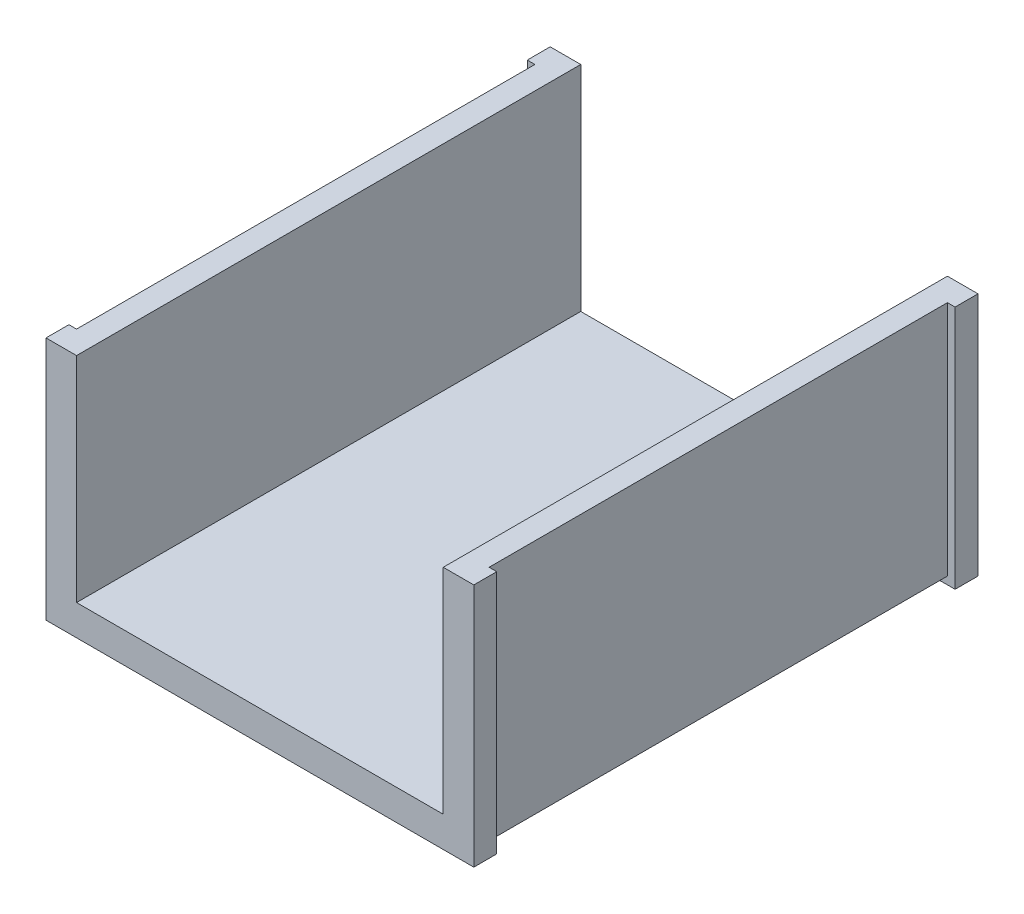
ISO-10303-21;
HEADER;
FILE_DESCRIPTION(('STEP AP214'),'2;1');
FILE_NAME('part.step','',(''),(''),'','','');
FILE_SCHEMA(('AUTOMOTIVE_DESIGN { 1 0 10303 214 1 1 1 1 }'));
ENDSEC;
DATA;
#1=APPLICATION_CONTEXT('core data for automotive mechanical design processes');
#2=APPLICATION_PROTOCOL_DEFINITION('international standard','automotive_design',2000,#1);
#3=PRODUCT_CONTEXT('',#1,'mechanical');
#4=PRODUCT('Part','Part','',(#3));
#5=PRODUCT_RELATED_PRODUCT_CATEGORY('part','',(#4));
#6=PRODUCT_DEFINITION_FORMATION('','',#4);
#7=PRODUCT_DEFINITION_CONTEXT('part definition',#1,'design');
#8=PRODUCT_DEFINITION('design','',#6,#7);
#9=PRODUCT_DEFINITION_SHAPE('','',#8);
#10=(LENGTH_UNIT() NAMED_UNIT(*) SI_UNIT(.MILLI.,.METRE.));
#11=(NAMED_UNIT(*) PLANE_ANGLE_UNIT() SI_UNIT($,.RADIAN.));
#12=(NAMED_UNIT(*) SI_UNIT($,.STERADIAN.) SOLID_ANGLE_UNIT());
#13=UNCERTAINTY_MEASURE_WITH_UNIT(LENGTH_MEASURE(1.E-05),#10,'distance_accuracy_value','');
#14=(GEOMETRIC_REPRESENTATION_CONTEXT(3) GLOBAL_UNCERTAINTY_ASSIGNED_CONTEXT((#13)) GLOBAL_UNIT_ASSIGNED_CONTEXT((#10,
#11,#12)) REPRESENTATION_CONTEXT('',''));
#15=CARTESIAN_POINT('',(0.,0.,0.));
#16=DIRECTION('',(0.,0.,1.));
#17=DIRECTION('',(1.,0.,0.));
#18=AXIS2_PLACEMENT_3D('',#15,#16,#17);
#19=CARTESIAN_POINT('',(0.,-9.47748147472008,-33.));
#20=DIRECTION('',(0.,1.,0.));
#21=DIRECTION('',(0.,0.,1.));
#22=AXIS2_PLACEMENT_3D('',#19,#20,#21);
#23=PLANE('',#22);
#24=DIRECTION('',(0.,0.,1.));
#25=VECTOR('',#24,1.);
#26=CARTESIAN_POINT('',(-38.25,-9.47748147472008,-31.5));
#27=LINE('',#26,#25);
#28=CARTESIAN_POINT('',(-38.25,-9.47748147472008,-31.5));
#29=VERTEX_POINT('',#28);
#30=CARTESIAN_POINT('',(-38.25,-9.47748147472008,-1.5));
#31=VERTEX_POINT('',#30);
#32=EDGE_CURVE('E226',#29,#31,#27,.T.);
#33=ORIENTED_EDGE('',*,*,#32,.F.);
#34=DIRECTION('',(-1.,0.,0.));
#35=VECTOR('',#34,1.);
#36=CARTESIAN_POINT('',(0.,-9.47748147472008,-31.5));
#37=LINE('',#36,#35);
#38=CARTESIAN_POINT('',(-37.75,-9.47748147472008,-31.5));
#39=VERTEX_POINT('',#38);
#40=EDGE_CURVE('E212',#39,#29,#37,.T.);
#41=ORIENTED_EDGE('',*,*,#40,.F.);
#42=DIRECTION('',(0.,0.,1.));
#43=VECTOR('',#42,1.);
#44=CARTESIAN_POINT('',(-37.75,-9.47748147472008,-33.));
#45=LINE('',#44,#43);
#46=CARTESIAN_POINT('',(-37.75,-9.47748147472008,-33.));
#47=VERTEX_POINT('',#46);
#48=EDGE_CURVE('E11',#47,#39,#45,.T.);
#49=ORIENTED_EDGE('',*,*,#48,.F.);
#50=DIRECTION('',(-1.,0.,0.));
#51=VECTOR('',#50,1.);
#52=CARTESIAN_POINT('',(0.,-9.47748147472008,-33.));
#53=LINE('',#52,#51);
#54=CARTESIAN_POINT('',(-39.75,-9.47748147472008,-33.));
#55=VERTEX_POINT('',#54);
#56=EDGE_CURVE('E158',#47,#55,#53,.T.);
#57=ORIENTED_EDGE('',*,*,#56,.T.);
#58=DIRECTION('',(0.,0.,1.));
#59=VECTOR('',#58,1.);
#60=CARTESIAN_POINT('',(-39.75,-9.47748147472008,-33.));
#61=LINE('',#60,#59);
#62=CARTESIAN_POINT('',(-39.75,-9.47748147472008,0.));
#63=VERTEX_POINT('',#62);
#64=EDGE_CURVE('E45',#55,#63,#61,.T.);
#65=ORIENTED_EDGE('',*,*,#64,.T.);
#66=DIRECTION('',(-1.,0.,0.));
#67=VECTOR('',#66,1.);
#68=CARTESIAN_POINT('',(0.,-9.47748147472008,0.));
#69=LINE('',#68,#67);
#70=CARTESIAN_POINT('',(-37.75,-9.47748147472008,0.));
#71=VERTEX_POINT('',#70);
#72=EDGE_CURVE('E163',#71,#63,#69,.T.);
#73=ORIENTED_EDGE('',*,*,#72,.F.);
#74=CARTESIAN_POINT('',(-37.75,-9.47748147472008,-1.5));
#75=VERTEX_POINT('',#74);
#76=EDGE_CURVE('E50',#75,#71,#45,.T.);
#77=ORIENTED_EDGE('',*,*,#76,.F.);
#78=DIRECTION('',(-1.,0.,0.));
#79=VECTOR('',#78,1.);
#80=CARTESIAN_POINT('',(0.,-9.47748147472008,-1.5));
#81=LINE('',#80,#79);
#82=EDGE_CURVE('E288',#75,#31,#81,.T.);
#83=ORIENTED_EDGE('',*,*,#82,.T.);
#84=EDGE_LOOP('',(#33,#41,#49,#57,#65,#73,#77,#83));
#85=FACE_BOUND('',#84,.T.);
#86=ADVANCED_FACE('F41',(#85),#23,.T.);
#87=CARTESIAN_POINT('',(-37.75,0.,-33.));
#88=DIRECTION('',(-1.,0.,0.));
#89=DIRECTION('',(0.,0.,1.));
#90=AXIS2_PLACEMENT_3D('',#87,#88,#89);
#91=PLANE('',#90);
#92=DIRECTION('',(0.,1.,0.));
#93=VECTOR('',#92,1.);
#94=CARTESIAN_POINT('',(-37.75,0.,-31.5));
#95=LINE('',#94,#93);
#96=CARTESIAN_POINT('',(-37.75,-25.4774814747201,-31.5));
#97=VERTEX_POINT('',#96);
#98=EDGE_CURVE('E228',#97,#39,#95,.T.);
#99=ORIENTED_EDGE('',*,*,#98,.F.);
#100=DIRECTION('',(0.,0.,1.));
#101=VECTOR('',#100,1.);
#102=CARTESIAN_POINT('',(-37.75,-25.4774814747201,-33.));
#103=LINE('',#102,#101);
#104=CARTESIAN_POINT('',(-37.75,-25.4774814747201,-33.));
#105=VERTEX_POINT('',#104);
#106=EDGE_CURVE('E184',#105,#97,#103,.T.);
#107=ORIENTED_EDGE('',*,*,#106,.F.);
#108=DIRECTION('',(0.,-1.,0.));
#109=VECTOR('',#108,1.);
#110=CARTESIAN_POINT('',(-37.75,0.,-33.));
#111=LINE('',#110,#109);
#112=EDGE_CURVE('E134',#47,#105,#111,.T.);
#113=ORIENTED_EDGE('',*,*,#112,.F.);
#114=ORIENTED_EDGE('',*,*,#48,.T.);
#115=EDGE_LOOP('',(#99,#107,#113,#114));
#116=FACE_BOUND('',#115,.T.);
#117=ADVANCED_FACE('F324',(#116),#91,.F.);
#118=CARTESIAN_POINT('',(0.,-25.4774814747201,-33.));
#119=DIRECTION('',(0.,1.,0.));
#120=DIRECTION('',(0.,0.,1.));
#121=AXIS2_PLACEMENT_3D('',#118,#119,#120);
#122=PLANE('',#121);
#123=DIRECTION('',(1.,0.,0.));
#124=VECTOR('',#123,1.);
#125=CARTESIAN_POINT('',(0.,-25.4774814747201,-31.5));
#126=LINE('',#125,#124);
#127=CARTESIAN_POINT('',(-65.75,-25.4774814747201,-31.5));
#128=VERTEX_POINT('',#127);
#129=EDGE_CURVE('E145',#128,#97,#126,.T.);
#130=ORIENTED_EDGE('',*,*,#129,.F.);
#131=DIRECTION('',(0.,0.,1.));
#132=VECTOR('',#131,1.);
#133=CARTESIAN_POINT('',(-65.75,-25.4774814747201,-33.));
#134=LINE('',#133,#132);
#135=CARTESIAN_POINT('',(-65.75,-25.4774814747201,-33.));
#136=VERTEX_POINT('',#135);
#137=EDGE_CURVE('E141',#136,#128,#134,.T.);
#138=ORIENTED_EDGE('',*,*,#137,.F.);
#139=DIRECTION('',(-1.,0.,0.));
#140=VECTOR('',#139,1.);
#141=CARTESIAN_POINT('',(0.,-25.4774814747201,-33.));
#142=LINE('',#141,#140);
#143=EDGE_CURVE('E126',#105,#136,#142,.T.);
#144=ORIENTED_EDGE('',*,*,#143,.F.);
#145=ORIENTED_EDGE('',*,*,#106,.T.);
#146=EDGE_LOOP('',(#130,#138,#144,#145));
#147=FACE_BOUND('',#146,.T.);
#148=ADVANCED_FACE('F142',(#147),#122,.F.);
#149=CARTESIAN_POINT('',(-65.75,0.,-33.));
#150=DIRECTION('',(-1.,0.,0.));
#151=DIRECTION('',(0.,0.,1.));
#152=AXIS2_PLACEMENT_3D('',#149,#150,#151);
#153=PLANE('',#152);
#154=ORIENTED_EDGE('',*,*,#137,.T.);
#155=DIRECTION('',(0.,-1.,0.));
#156=VECTOR('',#155,1.);
#157=CARTESIAN_POINT('',(-65.75,0.,-31.5));
#158=LINE('',#157,#156);
#159=CARTESIAN_POINT('',(-65.75,-9.47748147472008,-31.5));
#160=VERTEX_POINT('',#159);
#161=EDGE_CURVE('E321',#160,#128,#158,.T.);
#162=ORIENTED_EDGE('',*,*,#161,.F.);
#163=DIRECTION('',(0.,0.,1.));
#164=VECTOR('',#163,1.);
#165=CARTESIAN_POINT('',(-65.75,-9.47748147472008,-33.));
#166=LINE('',#165,#164);
#167=CARTESIAN_POINT('',(-65.75,-9.47748147472008,-33.));
#168=VERTEX_POINT('',#167);
#169=EDGE_CURVE('E153',#168,#160,#166,.T.);
#170=ORIENTED_EDGE('',*,*,#169,.F.);
#171=DIRECTION('',(0.,-1.,0.));
#172=VECTOR('',#171,1.);
#173=CARTESIAN_POINT('',(-65.75,0.,-33.));
#174=LINE('',#173,#172);
#175=EDGE_CURVE('E132',#168,#136,#174,.T.);
#176=ORIENTED_EDGE('',*,*,#175,.T.);
#177=EDGE_LOOP('',(#154,#162,#170,#176));
#178=FACE_BOUND('',#177,.T.);
#179=ADVANCED_FACE('F151',(#178),#153,.T.);
#180=ORIENTED_EDGE('',*,*,#169,.T.);
#181=DIRECTION('',(-1.,0.,0.));
#182=VECTOR('',#181,1.);
#183=CARTESIAN_POINT('',(0.,-9.47748147472008,-31.5));
#184=LINE('',#183,#182);
#185=CARTESIAN_POINT('',(-65.25,-9.47748147472008,-31.5));
#186=VERTEX_POINT('',#185);
#187=EDGE_CURVE('E319',#186,#160,#184,.T.);
#188=ORIENTED_EDGE('',*,*,#187,.F.);
#189=DIRECTION('',(0.,0.,1.));
#190=VECTOR('',#189,1.);
#191=CARTESIAN_POINT('',(-65.25,-9.47748147472008,-31.5));
#192=LINE('',#191,#190);
#193=CARTESIAN_POINT('',(-65.25,-9.47748147472008,-1.5));
#194=VERTEX_POINT('',#193);
#195=EDGE_CURVE('E167',#186,#194,#192,.T.);
#196=ORIENTED_EDGE('',*,*,#195,.T.);
#197=DIRECTION('',(-1.,0.,0.));
#198=VECTOR('',#197,1.);
#199=CARTESIAN_POINT('',(0.,-9.47748147472008,-1.5));
#200=LINE('',#199,#198);
#201=CARTESIAN_POINT('',(-65.75,-9.47748147472008,-1.5));
#202=VERTEX_POINT('',#201);
#203=EDGE_CURVE('E214',#194,#202,#200,.T.);
#204=ORIENTED_EDGE('',*,*,#203,.T.);
#205=CARTESIAN_POINT('',(-65.75,-9.47748147472008,0.));
#206=VERTEX_POINT('',#205);
#207=EDGE_CURVE('E187',#202,#206,#166,.T.);
#208=ORIENTED_EDGE('',*,*,#207,.T.);
#209=CARTESIAN_POINT('',(-63.75,-9.47748147472008,0.));
#210=VERTEX_POINT('',#209);
#211=EDGE_CURVE('E168',#210,#206,#69,.T.);
#212=ORIENTED_EDGE('',*,*,#211,.F.);
#213=DIRECTION('',(0.,0.,1.));
#214=VECTOR('',#213,1.);
#215=CARTESIAN_POINT('',(-63.75,-9.47748147472008,-33.));
#216=LINE('',#215,#214);
#217=CARTESIAN_POINT('',(-63.75,-9.47748147472008,-33.));
#218=VERTEX_POINT('',#217);
#219=EDGE_CURVE('E188',#218,#210,#216,.T.);
#220=ORIENTED_EDGE('',*,*,#219,.F.);
#221=EDGE_CURVE('E154',#218,#168,#53,.T.);
#222=ORIENTED_EDGE('',*,*,#221,.T.);
#223=EDGE_LOOP('',(#180,#188,#196,#204,#208,#212,#220,#222));
#224=FACE_BOUND('',#223,.T.);
#225=ADVANCED_FACE('F243',(#224),#23,.T.);
#226=CARTESIAN_POINT('',(-37.75,-25.4774814747201,-1.5));
#227=VERTEX_POINT('',#226);
#228=CARTESIAN_POINT('',(-37.75,-25.4774814747201,0.));
#229=VERTEX_POINT('',#228);
#230=EDGE_CURVE('E148',#227,#229,#103,.T.);
#231=ORIENTED_EDGE('',*,*,#230,.F.);
#232=DIRECTION('',(0.,1.,0.));
#233=VECTOR('',#232,1.);
#234=CARTESIAN_POINT('',(-37.75,0.,-1.5));
#235=LINE('',#234,#233);
#236=EDGE_CURVE('E204',#227,#75,#235,.T.);
#237=ORIENTED_EDGE('',*,*,#236,.T.);
#238=ORIENTED_EDGE('',*,*,#76,.T.);
#239=DIRECTION('',(0.,-1.,0.));
#240=VECTOR('',#239,1.);
#241=CARTESIAN_POINT('',(-37.75,0.,0.));
#242=LINE('',#241,#240);
#243=EDGE_CURVE('E182',#71,#229,#242,.T.);
#244=ORIENTED_EDGE('',*,*,#243,.T.);
#245=EDGE_LOOP('',(#231,#237,#238,#244));
#246=FACE_BOUND('',#245,.T.);
#247=ADVANCED_FACE('F201',(#246),#91,.F.);
#248=CARTESIAN_POINT('',(-65.75,-25.4774814747201,-1.5));
#249=VERTEX_POINT('',#248);
#250=CARTESIAN_POINT('',(-65.75,-25.4774814747201,0.));
#251=VERTEX_POINT('',#250);
#252=EDGE_CURVE('E149',#249,#251,#134,.T.);
#253=ORIENTED_EDGE('',*,*,#252,.F.);
#254=DIRECTION('',(1.,0.,0.));
#255=VECTOR('',#254,1.);
#256=CARTESIAN_POINT('',(0.,-25.4774814747201,-1.5));
#257=LINE('',#256,#255);
#258=EDGE_CURVE('E210',#249,#227,#257,.T.);
#259=ORIENTED_EDGE('',*,*,#258,.T.);
#260=ORIENTED_EDGE('',*,*,#230,.T.);
#261=DIRECTION('',(-1.,0.,0.));
#262=VECTOR('',#261,1.);
#263=CARTESIAN_POINT('',(0.,-25.4774814747201,0.));
#264=LINE('',#263,#262);
#265=EDGE_CURVE('E179',#229,#251,#264,.T.);
#266=ORIENTED_EDGE('',*,*,#265,.T.);
#267=EDGE_LOOP('',(#253,#259,#260,#266));
#268=FACE_BOUND('',#267,.T.);
#269=ADVANCED_FACE('F209',(#268),#122,.F.);
#270=DIRECTION('',(0.,-1.,0.));
#271=VECTOR('',#270,1.);
#272=CARTESIAN_POINT('',(-65.75,0.,-1.5));
#273=LINE('',#272,#271);
#274=EDGE_CURVE('E58',#202,#249,#273,.T.);
#275=ORIENTED_EDGE('',*,*,#274,.T.);
#276=ORIENTED_EDGE('',*,*,#252,.T.);
#277=DIRECTION('',(0.,-1.,0.));
#278=VECTOR('',#277,1.);
#279=CARTESIAN_POINT('',(-65.75,0.,0.));
#280=LINE('',#279,#278);
#281=EDGE_CURVE('E176',#206,#251,#280,.T.);
#282=ORIENTED_EDGE('',*,*,#281,.F.);
#283=ORIENTED_EDGE('',*,*,#207,.F.);
#284=EDGE_LOOP('',(#275,#276,#282,#283));
#285=FACE_BOUND('',#284,.T.);
#286=ADVANCED_FACE('F247',(#285),#153,.T.);
#287=CARTESIAN_POINT('',(-63.75,0.,-33.));
#288=DIRECTION('',(-1.,0.,0.));
#289=DIRECTION('',(0.,0.,1.));
#290=AXIS2_PLACEMENT_3D('',#287,#288,#289);
#291=PLANE('',#290);
#292=DIRECTION('',(0.,-1.,0.));
#293=VECTOR('',#292,1.);
#294=CARTESIAN_POINT('',(-63.75,0.,0.));
#295=LINE('',#294,#293);
#296=CARTESIAN_POINT('',(-63.75,-23.4774814747201,0.));
#297=VERTEX_POINT('',#296);
#298=EDGE_CURVE('E174',#210,#297,#295,.T.);
#299=ORIENTED_EDGE('',*,*,#298,.T.);
#300=DIRECTION('',(0.,0.,1.));
#301=VECTOR('',#300,1.);
#302=CARTESIAN_POINT('',(-63.75,-23.4774814747201,-33.));
#303=LINE('',#302,#301);
#304=CARTESIAN_POINT('',(-63.75,-23.4774814747201,-33.));
#305=VERTEX_POINT('',#304);
#306=EDGE_CURVE('E190',#305,#297,#303,.T.);
#307=ORIENTED_EDGE('',*,*,#306,.F.);
#308=DIRECTION('',(0.,-1.,0.));
#309=VECTOR('',#308,1.);
#310=CARTESIAN_POINT('',(-63.75,0.,-33.));
#311=LINE('',#310,#309);
#312=EDGE_CURVE('E156',#218,#305,#311,.T.);
#313=ORIENTED_EDGE('',*,*,#312,.F.);
#314=ORIENTED_EDGE('',*,*,#219,.T.);
#315=EDGE_LOOP('',(#299,#307,#313,#314));
#316=FACE_BOUND('',#315,.T.);
#317=ADVANCED_FACE('F236',(#316),#291,.F.);
#318=CARTESIAN_POINT('',(0.,-23.4774814747201,-33.));
#319=DIRECTION('',(0.,-1.,0.));
#320=DIRECTION('',(0.,0.,-1.));
#321=AXIS2_PLACEMENT_3D('',#318,#319,#320);
#322=PLANE('',#321);
#323=DIRECTION('',(1.,0.,0.));
#324=VECTOR('',#323,1.);
#325=CARTESIAN_POINT('',(0.,-23.4774814747201,0.));
#326=LINE('',#325,#324);
#327=CARTESIAN_POINT('',(-39.75,-23.4774814747201,0.));
#328=VERTEX_POINT('',#327);
#329=EDGE_CURVE('E171',#297,#328,#326,.T.);
#330=ORIENTED_EDGE('',*,*,#329,.T.);
#331=DIRECTION('',(0.,0.,1.));
#332=VECTOR('',#331,1.);
#333=CARTESIAN_POINT('',(-39.75,-23.4774814747201,-33.));
#334=LINE('',#333,#332);
#335=CARTESIAN_POINT('',(-39.75,-23.4774814747201,-33.));
#336=VERTEX_POINT('',#335);
#337=EDGE_CURVE('E192',#336,#328,#334,.T.);
#338=ORIENTED_EDGE('',*,*,#337,.F.);
#339=DIRECTION('',(1.,0.,0.));
#340=VECTOR('',#339,1.);
#341=CARTESIAN_POINT('',(0.,-23.4774814747201,-33.));
#342=LINE('',#341,#340);
#343=EDGE_CURVE('E231',#305,#336,#342,.T.);
#344=ORIENTED_EDGE('',*,*,#343,.F.);
#345=ORIENTED_EDGE('',*,*,#306,.T.);
#346=EDGE_LOOP('',(#330,#338,#344,#345));
#347=FACE_BOUND('',#346,.T.);
#348=ADVANCED_FACE('F239',(#347),#322,.F.);
#349=CARTESIAN_POINT('',(-39.75,0.,-33.));
#350=DIRECTION('',(-1.,0.,0.));
#351=DIRECTION('',(0.,0.,1.));
#352=AXIS2_PLACEMENT_3D('',#349,#350,#351);
#353=PLANE('',#352);
#354=DIRECTION('',(0.,-1.,0.));
#355=VECTOR('',#354,1.);
#356=CARTESIAN_POINT('',(-39.75,0.,0.));
#357=LINE('',#356,#355);
#358=EDGE_CURVE('E166',#63,#328,#357,.T.);
#359=ORIENTED_EDGE('',*,*,#358,.F.);
#360=ORIENTED_EDGE('',*,*,#64,.F.);
#361=DIRECTION('',(0.,-1.,0.));
#362=VECTOR('',#361,1.);
#363=CARTESIAN_POINT('',(-39.75,0.,-33.));
#364=LINE('',#363,#362);
#365=EDGE_CURVE('E230',#55,#336,#364,.T.);
#366=ORIENTED_EDGE('',*,*,#365,.T.);
#367=ORIENTED_EDGE('',*,*,#337,.T.);
#368=EDGE_LOOP('',(#359,#360,#366,#367));
#369=FACE_BOUND('',#368,.T.);
#370=ADVANCED_FACE('F43',(#369),#353,.T.);
#371=CARTESIAN_POINT('',(0.,0.,-33.));
#372=DIRECTION('',(0.,0.,1.));
#373=DIRECTION('',(1.,0.,0.));
#374=AXIS2_PLACEMENT_3D('',#371,#372,#373);
#375=PLANE('',#374);
#376=ORIENTED_EDGE('',*,*,#56,.F.);
#377=ORIENTED_EDGE('',*,*,#112,.T.);
#378=ORIENTED_EDGE('',*,*,#143,.T.);
#379=ORIENTED_EDGE('',*,*,#175,.F.);
#380=ORIENTED_EDGE('',*,*,#221,.F.);
#381=ORIENTED_EDGE('',*,*,#312,.T.);
#382=ORIENTED_EDGE('',*,*,#343,.T.);
#383=ORIENTED_EDGE('',*,*,#365,.F.);
#384=EDGE_LOOP('',(#376,#377,#378,#379,#380,#381,#382,#383));
#385=FACE_BOUND('',#384,.T.);
#386=ADVANCED_FACE('F129',(#385),#375,.F.);
#387=CARTESIAN_POINT('',(0.,0.,0.));
#388=DIRECTION('',(0.,0.,1.));
#389=DIRECTION('',(1.,0.,0.));
#390=AXIS2_PLACEMENT_3D('',#387,#388,#389);
#391=PLANE('',#390);
#392=ORIENTED_EDGE('',*,*,#72,.T.);
#393=ORIENTED_EDGE('',*,*,#358,.T.);
#394=ORIENTED_EDGE('',*,*,#329,.F.);
#395=ORIENTED_EDGE('',*,*,#298,.F.);
#396=ORIENTED_EDGE('',*,*,#211,.T.);
#397=ORIENTED_EDGE('',*,*,#281,.T.);
#398=ORIENTED_EDGE('',*,*,#265,.F.);
#399=ORIENTED_EDGE('',*,*,#243,.F.);
#400=EDGE_LOOP('',(#392,#393,#394,#395,#396,#397,#398,#399));
#401=FACE_BOUND('',#400,.T.);
#402=ADVANCED_FACE('F198',(#401),#391,.T.);
#403=CARTESIAN_POINT('',(-65.25,0.,-31.5));
#404=DIRECTION('',(-1.,0.,0.));
#405=DIRECTION('',(0.,0.,1.));
#406=AXIS2_PLACEMENT_3D('',#403,#404,#405);
#407=PLANE('',#406);
#408=DIRECTION('',(0.,-1.,0.));
#409=VECTOR('',#408,1.);
#410=CARTESIAN_POINT('',(-65.25,0.,-1.5));
#411=LINE('',#410,#409);
#412=CARTESIAN_POINT('',(-65.25,-24.9774814747201,-1.5));
#413=VERTEX_POINT('',#412);
#414=EDGE_CURVE('E300',#194,#413,#411,.T.);
#415=ORIENTED_EDGE('',*,*,#414,.F.);
#416=ORIENTED_EDGE('',*,*,#195,.F.);
#417=DIRECTION('',(0.,-1.,0.));
#418=VECTOR('',#417,1.);
#419=CARTESIAN_POINT('',(-65.25,0.,-31.5));
#420=LINE('',#419,#418);
#421=CARTESIAN_POINT('',(-65.25,-24.9774814747201,-31.5));
#422=VERTEX_POINT('',#421);
#423=EDGE_CURVE('E306',#186,#422,#420,.T.);
#424=ORIENTED_EDGE('',*,*,#423,.T.);
#425=DIRECTION('',(0.,0.,1.));
#426=VECTOR('',#425,1.);
#427=CARTESIAN_POINT('',(-65.25,-24.9774814747201,-31.5));
#428=LINE('',#427,#426);
#429=EDGE_CURVE('E220',#422,#413,#428,.T.);
#430=ORIENTED_EDGE('',*,*,#429,.T.);
#431=EDGE_LOOP('',(#415,#416,#424,#430));
#432=FACE_BOUND('',#431,.T.);
#433=ADVANCED_FACE('F304',(#432),#407,.T.);
#434=CARTESIAN_POINT('',(0.,-24.9774814747201,-31.5));
#435=DIRECTION('',(0.,-1.,0.));
#436=DIRECTION('',(0.,0.,-1.));
#437=AXIS2_PLACEMENT_3D('',#434,#435,#436);
#438=PLANE('',#437);
#439=DIRECTION('',(1.,0.,0.));
#440=VECTOR('',#439,1.);
#441=CARTESIAN_POINT('',(0.,-24.9774814747201,-1.5));
#442=LINE('',#441,#440);
#443=CARTESIAN_POINT('',(-38.25,-24.9774814747201,-1.5));
#444=VERTEX_POINT('',#443);
#445=EDGE_CURVE('E294',#413,#444,#442,.T.);
#446=ORIENTED_EDGE('',*,*,#445,.F.);
#447=ORIENTED_EDGE('',*,*,#429,.F.);
#448=DIRECTION('',(1.,0.,0.));
#449=VECTOR('',#448,1.);
#450=CARTESIAN_POINT('',(0.,-24.9774814747201,-31.5));
#451=LINE('',#450,#449);
#452=CARTESIAN_POINT('',(-38.25,-24.9774814747201,-31.5));
#453=VERTEX_POINT('',#452);
#454=EDGE_CURVE('E310',#422,#453,#451,.T.);
#455=ORIENTED_EDGE('',*,*,#454,.T.);
#456=DIRECTION('',(0.,0.,1.));
#457=VECTOR('',#456,1.);
#458=CARTESIAN_POINT('',(-38.25,-24.9774814747201,-31.5));
#459=LINE('',#458,#457);
#460=EDGE_CURVE('E223',#453,#444,#459,.T.);
#461=ORIENTED_EDGE('',*,*,#460,.T.);
#462=EDGE_LOOP('',(#446,#447,#455,#461));
#463=FACE_BOUND('',#462,.T.);
#464=ADVANCED_FACE('F309',(#463),#438,.T.);
#465=CARTESIAN_POINT('',(-38.25,0.,-31.5));
#466=DIRECTION('',(-1.,0.,0.));
#467=DIRECTION('',(0.,0.,1.));
#468=AXIS2_PLACEMENT_3D('',#465,#466,#467);
#469=PLANE('',#468);
#470=DIRECTION('',(0.,-1.,0.));
#471=VECTOR('',#470,1.);
#472=CARTESIAN_POINT('',(-38.25,0.,-1.5));
#473=LINE('',#472,#471);
#474=EDGE_CURVE('E292',#31,#444,#473,.T.);
#475=ORIENTED_EDGE('',*,*,#474,.T.);
#476=ORIENTED_EDGE('',*,*,#460,.F.);
#477=DIRECTION('',(0.,-1.,0.));
#478=VECTOR('',#477,1.);
#479=CARTESIAN_POINT('',(-38.25,0.,-31.5));
#480=LINE('',#479,#478);
#481=EDGE_CURVE('E283',#29,#453,#480,.T.);
#482=ORIENTED_EDGE('',*,*,#481,.F.);
#483=ORIENTED_EDGE('',*,*,#32,.T.);
#484=EDGE_LOOP('',(#475,#476,#482,#483));
#485=FACE_BOUND('',#484,.T.);
#486=ADVANCED_FACE('F311',(#485),#469,.F.);
#487=CARTESIAN_POINT('',(0.,0.,-31.5));
#488=DIRECTION('',(0.,0.,1.));
#489=DIRECTION('',(1.,0.,0.));
#490=AXIS2_PLACEMENT_3D('',#487,#488,#489);
#491=PLANE('',#490);
#492=ORIENTED_EDGE('',*,*,#40,.T.);
#493=ORIENTED_EDGE('',*,*,#481,.T.);
#494=ORIENTED_EDGE('',*,*,#454,.F.);
#495=ORIENTED_EDGE('',*,*,#423,.F.);
#496=ORIENTED_EDGE('',*,*,#187,.T.);
#497=ORIENTED_EDGE('',*,*,#161,.T.);
#498=ORIENTED_EDGE('',*,*,#129,.T.);
#499=ORIENTED_EDGE('',*,*,#98,.T.);
#500=EDGE_LOOP('',(#492,#493,#494,#495,#496,#497,#498,#499));
#501=FACE_BOUND('',#500,.T.);
#502=ADVANCED_FACE('F313',(#501),#491,.T.);
#503=CARTESIAN_POINT('',(0.,0.,-1.5));
#504=DIRECTION('',(0.,0.,1.));
#505=DIRECTION('',(1.,0.,0.));
#506=AXIS2_PLACEMENT_3D('',#503,#504,#505);
#507=PLANE('',#506);
#508=ORIENTED_EDGE('',*,*,#82,.F.);
#509=ORIENTED_EDGE('',*,*,#236,.F.);
#510=ORIENTED_EDGE('',*,*,#258,.F.);
#511=ORIENTED_EDGE('',*,*,#274,.F.);
#512=ORIENTED_EDGE('',*,*,#203,.F.);
#513=ORIENTED_EDGE('',*,*,#414,.T.);
#514=ORIENTED_EDGE('',*,*,#445,.T.);
#515=ORIENTED_EDGE('',*,*,#474,.F.);
#516=EDGE_LOOP('',(#508,#509,#510,#511,#512,#513,#514,#515));
#517=FACE_BOUND('',#516,.T.);
#518=ADVANCED_FACE('F289',(#517),#507,.F.);
#519=CLOSED_SHELL('',(#86,#117,#148,#179,#225,#247,#269,#286,#317,#348,#370,#386,#402,#433,#464,
#486,#502,#518));
#520=MANIFOLD_SOLID_BREP('B2',#519);
#521=ADVANCED_BREP_SHAPE_REPRESENTATION('',(#18,#520),#14);
#522=SHAPE_DEFINITION_REPRESENTATION(#9,#521);
ENDSEC;
END-ISO-10303-21;
